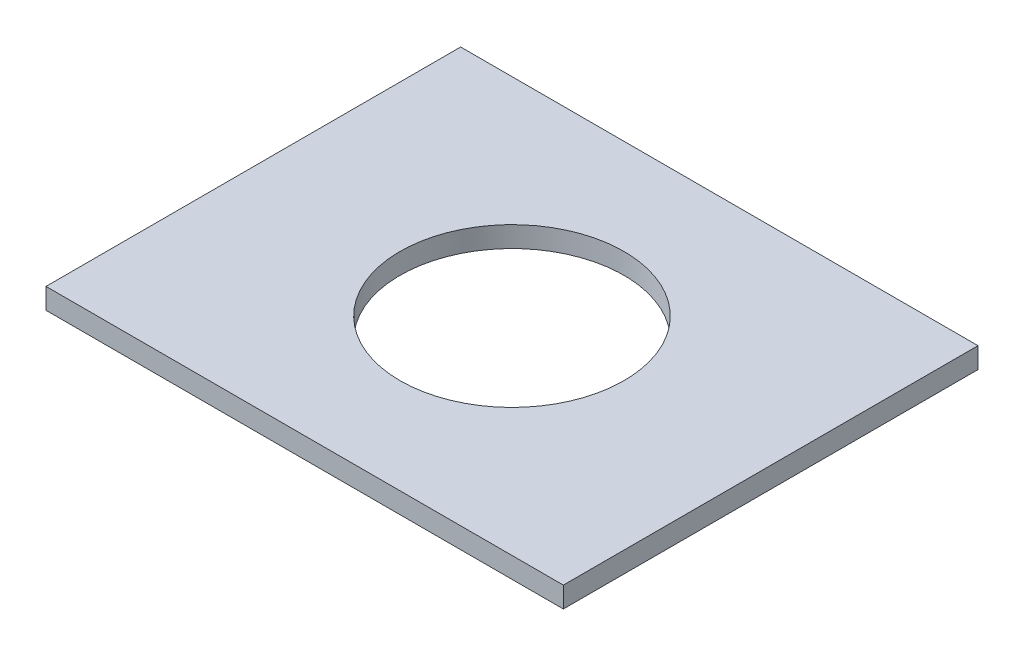
ISO-10303-21;
HEADER;
FILE_DESCRIPTION(('STEP AP214'),'2;1');
FILE_NAME('part.step','',(''),(''),'','','');
FILE_SCHEMA(('AUTOMOTIVE_DESIGN { 1 0 10303 214 1 1 1 1 }'));
ENDSEC;
DATA;
#1=APPLICATION_CONTEXT('core data for automotive mechanical design processes');
#2=APPLICATION_PROTOCOL_DEFINITION('international standard','automotive_design',2000,#1);
#3=PRODUCT_CONTEXT('',#1,'mechanical');
#4=PRODUCT('Part','Part','',(#3));
#5=PRODUCT_RELATED_PRODUCT_CATEGORY('part','',(#4));
#6=PRODUCT_DEFINITION_FORMATION('','',#4);
#7=PRODUCT_DEFINITION_CONTEXT('part definition',#1,'design');
#8=PRODUCT_DEFINITION('design','',#6,#7);
#9=PRODUCT_DEFINITION_SHAPE('','',#8);
#10=(LENGTH_UNIT() NAMED_UNIT(*) SI_UNIT(.MILLI.,.METRE.));
#11=(NAMED_UNIT(*) PLANE_ANGLE_UNIT() SI_UNIT($,.RADIAN.));
#12=(NAMED_UNIT(*) SI_UNIT($,.STERADIAN.) SOLID_ANGLE_UNIT());
#13=UNCERTAINTY_MEASURE_WITH_UNIT(LENGTH_MEASURE(1.E-05),#10,'distance_accuracy_value','');
#14=(GEOMETRIC_REPRESENTATION_CONTEXT(3) GLOBAL_UNCERTAINTY_ASSIGNED_CONTEXT((#13)) GLOBAL_UNIT_ASSIGNED_CONTEXT((#10,
#11,#12)) REPRESENTATION_CONTEXT('',''));
#15=CARTESIAN_POINT('',(0.,0.,0.));
#16=DIRECTION('',(0.,0.,1.));
#17=DIRECTION('',(1.,0.,0.));
#18=AXIS2_PLACEMENT_3D('',#15,#16,#17);
#19=CARTESIAN_POINT('',(-62.38,5.,50.));
#20=DIRECTION('',(1.,0.,0.));
#21=DIRECTION('',(0.,0.,-1.));
#22=AXIS2_PLACEMENT_3D('',#19,#20,#21);
#23=PLANE('',#22);
#24=DIRECTION('',(0.,0.,1.));
#25=VECTOR('',#24,1.);
#26=CARTESIAN_POINT('',(-62.38,0.,50.));
#27=LINE('',#26,#25);
#28=CARTESIAN_POINT('',(-62.38,0.,-50.));
#29=VERTEX_POINT('',#28);
#30=CARTESIAN_POINT('',(-62.38,0.,50.));
#31=VERTEX_POINT('',#30);
#32=EDGE_CURVE('E98',#29,#31,#27,.T.);
#33=ORIENTED_EDGE('',*,*,#32,.T.);
#34=DIRECTION('',(0.,-1.,0.));
#35=VECTOR('',#34,1.);
#36=CARTESIAN_POINT('',(-62.38,5.,50.));
#37=LINE('',#36,#35);
#38=CARTESIAN_POINT('',(-62.38,5.,50.));
#39=VERTEX_POINT('',#38);
#40=EDGE_CURVE('E11',#39,#31,#37,.T.);
#41=ORIENTED_EDGE('',*,*,#40,.F.);
#42=DIRECTION('',(0.,0.,1.));
#43=VECTOR('',#42,1.);
#44=CARTESIAN_POINT('',(-62.38,5.,50.));
#45=LINE('',#44,#43);
#46=CARTESIAN_POINT('',(-62.38,5.,-50.));
#47=VERTEX_POINT('',#46);
#48=EDGE_CURVE('E86',#47,#39,#45,.T.);
#49=ORIENTED_EDGE('',*,*,#48,.F.);
#50=DIRECTION('',(0.,-1.,0.));
#51=VECTOR('',#50,1.);
#52=CARTESIAN_POINT('',(-62.38,5.,-50.));
#53=LINE('',#52,#51);
#54=EDGE_CURVE('E94',#47,#29,#53,.T.);
#55=ORIENTED_EDGE('',*,*,#54,.T.);
#56=EDGE_LOOP('',(#33,#41,#49,#55));
#57=FACE_BOUND('',#56,.T.);
#58=ADVANCED_FACE('F35',(#57),#23,.F.);
#59=CARTESIAN_POINT('',(-62.38,5.,50.));
#60=DIRECTION('',(0.,0.,-1.));
#61=DIRECTION('',(-1.,0.,0.));
#62=AXIS2_PLACEMENT_3D('',#59,#60,#61);
#63=PLANE('',#62);
#64=DIRECTION('',(1.,0.,0.));
#65=VECTOR('',#64,1.);
#66=CARTESIAN_POINT('',(-62.38,0.,50.));
#67=LINE('',#66,#65);
#68=CARTESIAN_POINT('',(62.38,0.,50.));
#69=VERTEX_POINT('',#68);
#70=EDGE_CURVE('E90',#31,#69,#67,.T.);
#71=ORIENTED_EDGE('',*,*,#70,.T.);
#72=DIRECTION('',(0.,-1.,0.));
#73=VECTOR('',#72,1.);
#74=CARTESIAN_POINT('',(62.38,5.,50.));
#75=LINE('',#74,#73);
#76=CARTESIAN_POINT('',(62.38,5.,50.));
#77=VERTEX_POINT('',#76);
#78=EDGE_CURVE('E43',#77,#69,#75,.T.);
#79=ORIENTED_EDGE('',*,*,#78,.F.);
#80=DIRECTION('',(1.,0.,0.));
#81=VECTOR('',#80,1.);
#82=CARTESIAN_POINT('',(-62.38,5.,50.));
#83=LINE('',#82,#81);
#84=EDGE_CURVE('E81',#39,#77,#83,.T.);
#85=ORIENTED_EDGE('',*,*,#84,.F.);
#86=ORIENTED_EDGE('',*,*,#40,.T.);
#87=EDGE_LOOP('',(#71,#79,#85,#86));
#88=FACE_BOUND('',#87,.T.);
#89=ADVANCED_FACE('F89',(#88),#63,.F.);
#90=CARTESIAN_POINT('',(62.38,5.,50.));
#91=DIRECTION('',(-1.,0.,0.));
#92=DIRECTION('',(0.,0.,1.));
#93=AXIS2_PLACEMENT_3D('',#90,#91,#92);
#94=PLANE('',#93);
#95=DIRECTION('',(0.,0.,-1.));
#96=VECTOR('',#95,1.);
#97=CARTESIAN_POINT('',(62.38,0.,50.));
#98=LINE('',#97,#96);
#99=CARTESIAN_POINT('',(62.38,0.,-50.));
#100=VERTEX_POINT('',#99);
#101=EDGE_CURVE('E68',#69,#100,#98,.T.);
#102=ORIENTED_EDGE('',*,*,#101,.T.);
#103=DIRECTION('',(0.,-1.,0.));
#104=VECTOR('',#103,1.);
#105=CARTESIAN_POINT('',(62.38,5.,-50.));
#106=LINE('',#105,#104);
#107=CARTESIAN_POINT('',(62.38,5.,-50.));
#108=VERTEX_POINT('',#107);
#109=EDGE_CURVE('E91',#108,#100,#106,.T.);
#110=ORIENTED_EDGE('',*,*,#109,.F.);
#111=DIRECTION('',(0.,0.,-1.));
#112=VECTOR('',#111,1.);
#113=CARTESIAN_POINT('',(62.38,5.,50.));
#114=LINE('',#113,#112);
#115=EDGE_CURVE('E84',#77,#108,#114,.T.);
#116=ORIENTED_EDGE('',*,*,#115,.F.);
#117=ORIENTED_EDGE('',*,*,#78,.T.);
#118=EDGE_LOOP('',(#102,#110,#116,#117));
#119=FACE_BOUND('',#118,.T.);
#120=ADVANCED_FACE('F92',(#119),#94,.F.);
#121=CARTESIAN_POINT('',(-62.38,5.,-50.));
#122=DIRECTION('',(0.,0.,1.));
#123=DIRECTION('',(1.,0.,0.));
#124=AXIS2_PLACEMENT_3D('',#121,#122,#123);
#125=PLANE('',#124);
#126=DIRECTION('',(-1.,0.,0.));
#127=VECTOR('',#126,1.);
#128=CARTESIAN_POINT('',(-62.38,0.,-50.));
#129=LINE('',#128,#127);
#130=EDGE_CURVE('E74',#100,#29,#129,.T.);
#131=ORIENTED_EDGE('',*,*,#130,.T.);
#132=ORIENTED_EDGE('',*,*,#54,.F.);
#133=DIRECTION('',(-1.,0.,0.));
#134=VECTOR('',#133,1.);
#135=CARTESIAN_POINT('',(-62.38,5.,-50.));
#136=LINE('',#135,#134);
#137=EDGE_CURVE('E51',#108,#47,#136,.T.);
#138=ORIENTED_EDGE('',*,*,#137,.F.);
#139=ORIENTED_EDGE('',*,*,#109,.T.);
#140=EDGE_LOOP('',(#131,#132,#138,#139));
#141=FACE_BOUND('',#140,.T.);
#142=ADVANCED_FACE('F106',(#141),#125,.F.);
#143=CARTESIAN_POINT('',(0.,5.,0.));
#144=DIRECTION('',(0.,-1.,0.));
#145=DIRECTION('',(0.,0.,-1.));
#146=AXIS2_PLACEMENT_3D('',#143,#144,#145);
#147=PLANE('',#146);
#148=CARTESIAN_POINT('',(0.,5.,0.));
#149=DIRECTION('',(0.,1.,0.));
#150=DIRECTION('',(0.,0.,1.));
#151=AXIS2_PLACEMENT_3D('',#148,#149,#150);
#152=CIRCLE('',#151,27.);
#153=CARTESIAN_POINT('',(0.,5.,27.));
#154=VERTEX_POINT('',#153);
#155=EDGE_CURVE('E112',#154,#154,#152,.T.);
#156=ORIENTED_EDGE('',*,*,#155,.F.);
#157=EDGE_LOOP('',(#156));
#158=FACE_BOUND('',#157,.T.);
#159=ORIENTED_EDGE('',*,*,#48,.T.);
#160=ORIENTED_EDGE('',*,*,#84,.T.);
#161=ORIENTED_EDGE('',*,*,#115,.T.);
#162=ORIENTED_EDGE('',*,*,#137,.T.);
#163=EDGE_LOOP('',(#159,#160,#161,#162));
#164=FACE_BOUND('',#163,.T.);
#165=ADVANCED_FACE('F82',(#158,#164),#147,.F.);
#166=CARTESIAN_POINT('',(0.,0.,0.));
#167=DIRECTION('',(0.,-1.,0.));
#168=DIRECTION('',(0.,0.,-1.));
#169=AXIS2_PLACEMENT_3D('',#166,#167,#168);
#170=PLANE('',#169);
#171=CARTESIAN_POINT('',(0.,0.,0.));
#172=DIRECTION('',(0.,1.,0.));
#173=DIRECTION('',(0.,0.,1.));
#174=AXIS2_PLACEMENT_3D('',#171,#172,#173);
#175=CIRCLE('',#174,27.);
#176=CARTESIAN_POINT('',(0.,0.,27.));
#177=VERTEX_POINT('',#176);
#178=EDGE_CURVE('E101',#177,#177,#175,.T.);
#179=ORIENTED_EDGE('',*,*,#178,.T.);
#180=EDGE_LOOP('',(#179));
#181=FACE_BOUND('',#180,.T.);
#182=ORIENTED_EDGE('',*,*,#32,.F.);
#183=ORIENTED_EDGE('',*,*,#130,.F.);
#184=ORIENTED_EDGE('',*,*,#101,.F.);
#185=ORIENTED_EDGE('',*,*,#70,.F.);
#186=EDGE_LOOP('',(#182,#183,#184,#185));
#187=FACE_BOUND('',#186,.T.);
#188=ADVANCED_FACE('F109',(#181,#187),#170,.T.);
#189=CARTESIAN_POINT('',(0.,0.,0.));
#190=DIRECTION('',(0.,1.,0.));
#191=DIRECTION('',(0.,0.,1.));
#192=AXIS2_PLACEMENT_3D('',#189,#190,#191);
#193=CYLINDRICAL_SURFACE('',#192,27.);
#194=ORIENTED_EDGE('',*,*,#178,.F.);
#195=EDGE_LOOP('',(#194));
#196=FACE_BOUND('',#195,.T.);
#197=ORIENTED_EDGE('',*,*,#155,.T.);
#198=EDGE_LOOP('',(#197));
#199=FACE_BOUND('',#198,.T.);
#200=ADVANCED_FACE('F119',(#196,#199),#193,.F.);
#201=CLOSED_SHELL('',(#58,#89,#120,#142,#165,#188,#200));
#202=MANIFOLD_SOLID_BREP('B2',#201);
#203=ADVANCED_BREP_SHAPE_REPRESENTATION('',(#18,#202),#14);
#204=SHAPE_DEFINITION_REPRESENTATION(#9,#203);
ENDSEC;
END-ISO-10303-21;
